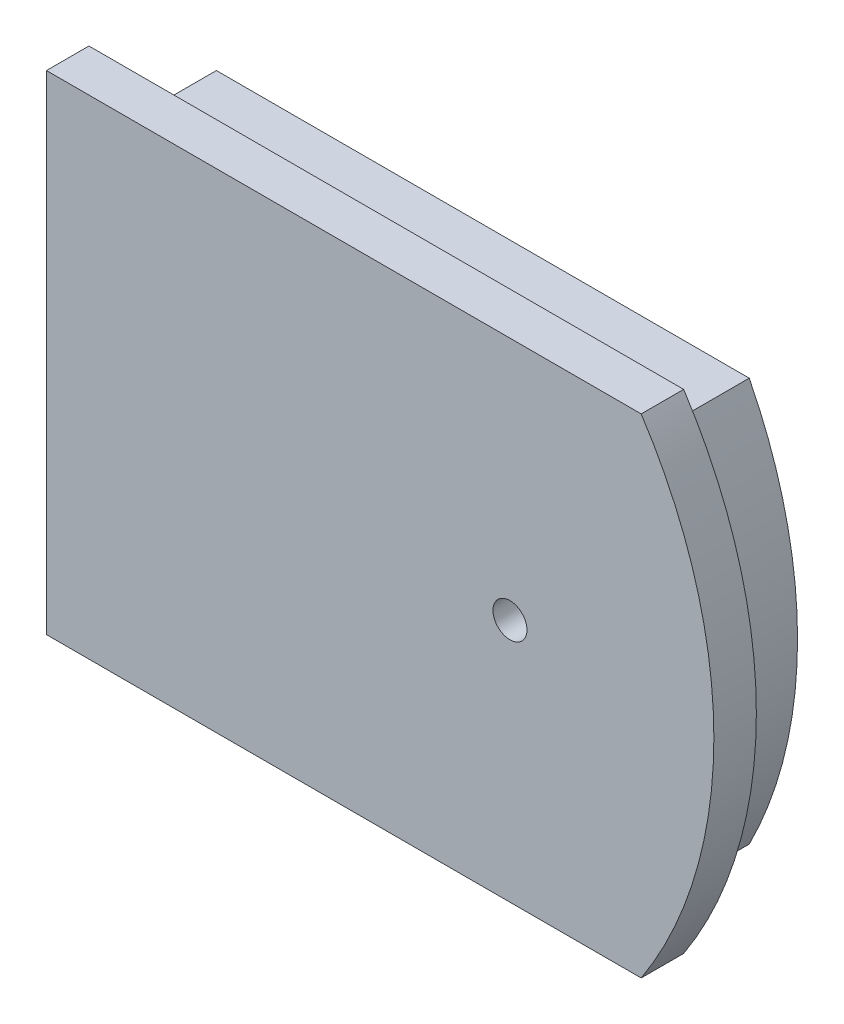
ISO-10303-21;
HEADER;
FILE_DESCRIPTION(('STEP AP214'),'2;1');
FILE_NAME('part.step','',(''),(''),'','','');
FILE_SCHEMA(('AUTOMOTIVE_DESIGN { 1 0 10303 214 1 1 1 1 }'));
ENDSEC;
DATA;
#1=APPLICATION_CONTEXT('core data for automotive mechanical design processes');
#2=APPLICATION_PROTOCOL_DEFINITION('international standard','automotive_design',2000,#1);
#3=PRODUCT_CONTEXT('',#1,'mechanical');
#4=PRODUCT('Part','Part','',(#3));
#5=PRODUCT_RELATED_PRODUCT_CATEGORY('part','',(#4));
#6=PRODUCT_DEFINITION_FORMATION('','',#4);
#7=PRODUCT_DEFINITION_CONTEXT('part definition',#1,'design');
#8=PRODUCT_DEFINITION('design','',#6,#7);
#9=PRODUCT_DEFINITION_SHAPE('','',#8);
#10=(LENGTH_UNIT() NAMED_UNIT(*) SI_UNIT(.MILLI.,.METRE.));
#11=(NAMED_UNIT(*) PLANE_ANGLE_UNIT() SI_UNIT($,.RADIAN.));
#12=(NAMED_UNIT(*) SI_UNIT($,.STERADIAN.) SOLID_ANGLE_UNIT());
#13=UNCERTAINTY_MEASURE_WITH_UNIT(LENGTH_MEASURE(1.E-05),#10,'distance_accuracy_value','');
#14=(GEOMETRIC_REPRESENTATION_CONTEXT(3) GLOBAL_UNCERTAINTY_ASSIGNED_CONTEXT((#13)) GLOBAL_UNIT_ASSIGNED_CONTEXT((#10,
#11,#12)) REPRESENTATION_CONTEXT('',''));
#15=CARTESIAN_POINT('',(0.,0.,0.));
#16=DIRECTION('',(0.,0.,1.));
#17=DIRECTION('',(1.,0.,0.));
#18=AXIS2_PLACEMENT_3D('',#15,#16,#17);
#19=CARTESIAN_POINT('',(0.,0.,0.));
#20=DIRECTION('',(0.,0.,-1.));
#21=DIRECTION('',(-1.,0.,0.));
#22=AXIS2_PLACEMENT_3D('',#19,#20,#21);
#23=PLANE('',#22);
#24=CARTESIAN_POINT('',(-28.0676149977944,0.,0.));
#25=DIRECTION('',(0.,0.,-1.));
#26=DIRECTION('',(-1.,0.,0.));
#27=AXIS2_PLACEMENT_3D('',#24,#25,#26);
#28=CIRCLE('',#27,104.87320161785);
#29=CARTESIAN_POINT('',(65.4317883028584,47.5,0.));
#30=VERTEX_POINT('',#29);
#31=CARTESIAN_POINT('',(65.4317883028584,-47.5,0.));
#32=VERTEX_POINT('',#31);
#33=EDGE_CURVE('E147',#30,#32,#28,.T.);
#34=ORIENTED_EDGE('',*,*,#33,.F.);
#35=DIRECTION('',(1.,0.,0.));
#36=VECTOR('',#35,1.);
#37=CARTESIAN_POINT('',(-60.,47.5,0.));
#38=LINE('',#37,#36);
#39=CARTESIAN_POINT('',(-60.,47.5,0.));
#40=VERTEX_POINT('',#39);
#41=EDGE_CURVE('E143',#40,#30,#38,.T.);
#42=ORIENTED_EDGE('',*,*,#41,.F.);
#43=DIRECTION('',(0.,-1.,0.));
#44=VECTOR('',#43,1.);
#45=CARTESIAN_POINT('',(-60.,47.5,0.));
#46=LINE('',#45,#44);
#47=CARTESIAN_POINT('',(-60.,-47.5,0.));
#48=VERTEX_POINT('',#47);
#49=EDGE_CURVE('E139',#40,#48,#46,.T.);
#50=ORIENTED_EDGE('',*,*,#49,.T.);
#51=DIRECTION('',(1.,0.,0.));
#52=VECTOR('',#51,1.);
#53=CARTESIAN_POINT('',(-60.,-47.5,0.));
#54=LINE('',#53,#52);
#55=EDGE_CURVE('E56',#48,#32,#54,.T.);
#56=ORIENTED_EDGE('',*,*,#55,.T.);
#57=EDGE_LOOP('',(#34,#42,#50,#56));
#58=FACE_BOUND('',#57,.T.);
#59=DIRECTION('',(1.,0.,0.));
#60=VECTOR('',#59,1.);
#61=CARTESIAN_POINT('',(-70.,-57.5,0.));
#62=LINE('',#61,#60);
#63=CARTESIAN_POINT('',(-70.,-57.5,0.));
#64=VERTEX_POINT('',#63);
#65=CARTESIAN_POINT('',(70.,-57.5,0.));
#66=VERTEX_POINT('',#65);
#67=EDGE_CURVE('E97',#64,#66,#62,.T.);
#68=ORIENTED_EDGE('',*,*,#67,.F.);
#69=DIRECTION('',(0.,-1.,0.));
#70=VECTOR('',#69,1.);
#71=CARTESIAN_POINT('',(-70.,57.5,0.));
#72=LINE('',#71,#70);
#73=CARTESIAN_POINT('',(-70.,57.5,0.));
#74=VERTEX_POINT('',#73);
#75=EDGE_CURVE('E81',#74,#64,#72,.T.);
#76=ORIENTED_EDGE('',*,*,#75,.F.);
#77=DIRECTION('',(1.,0.,0.));
#78=VECTOR('',#77,1.);
#79=CARTESIAN_POINT('',(-70.,57.5,0.));
#80=LINE('',#79,#78);
#81=CARTESIAN_POINT('',(70.,57.5,0.));
#82=VERTEX_POINT('',#81);
#83=EDGE_CURVE('E92',#74,#82,#80,.T.);
#84=ORIENTED_EDGE('',*,*,#83,.T.);
#85=CARTESIAN_POINT('',(-18.0676149977944,0.,0.));
#86=DIRECTION('',(0.,0.,1.));
#87=DIRECTION('',(1.,0.,0.));
#88=AXIS2_PLACEMENT_3D('',#85,#86,#87);
#89=CIRCLE('',#88,105.176778860164);
#90=EDGE_CURVE('E100',#66,#82,#89,.T.);
#91=ORIENTED_EDGE('',*,*,#90,.F.);
#92=EDGE_LOOP('',(#68,#76,#84,#91));
#93=FACE_BOUND('',#92,.T.);
#94=ADVANCED_FACE('F41',(#58,#93),#23,.T.);
#95=CARTESIAN_POINT('',(-70.,-57.5,10.));
#96=DIRECTION('',(0.,1.,0.));
#97=DIRECTION('',(0.,0.,1.));
#98=AXIS2_PLACEMENT_3D('',#95,#96,#97);
#99=PLANE('',#98);
#100=ORIENTED_EDGE('',*,*,#67,.T.);
#101=DIRECTION('',(0.,0.,-1.));
#102=VECTOR('',#101,1.);
#103=CARTESIAN_POINT('',(70.,-57.5,10.));
#104=LINE('',#103,#102);
#105=CARTESIAN_POINT('',(70.,-57.5,10.));
#106=VERTEX_POINT('',#105);
#107=EDGE_CURVE('E11',#106,#66,#104,.T.);
#108=ORIENTED_EDGE('',*,*,#107,.F.);
#109=DIRECTION('',(1.,0.,0.));
#110=VECTOR('',#109,1.);
#111=CARTESIAN_POINT('',(-70.,-57.5,10.));
#112=LINE('',#111,#110);
#113=CARTESIAN_POINT('',(-70.,-57.5,10.));
#114=VERTEX_POINT('',#113);
#115=EDGE_CURVE('E91',#114,#106,#112,.T.);
#116=ORIENTED_EDGE('',*,*,#115,.F.);
#117=DIRECTION('',(0.,0.,-1.));
#118=VECTOR('',#117,1.);
#119=CARTESIAN_POINT('',(-70.,-57.5,10.));
#120=LINE('',#119,#118);
#121=EDGE_CURVE('E84',#114,#64,#120,.T.);
#122=ORIENTED_EDGE('',*,*,#121,.T.);
#123=EDGE_LOOP('',(#100,#108,#116,#122));
#124=FACE_BOUND('',#123,.T.);
#125=ADVANCED_FACE('F43',(#124),#99,.F.);
#126=CARTESIAN_POINT('',(-70.,57.5,10.));
#127=DIRECTION('',(0.,1.,0.));
#128=DIRECTION('',(0.,0.,1.));
#129=AXIS2_PLACEMENT_3D('',#126,#127,#128);
#130=PLANE('',#129);
#131=ORIENTED_EDGE('',*,*,#83,.F.);
#132=DIRECTION('',(0.,0.,-1.));
#133=VECTOR('',#132,1.);
#134=CARTESIAN_POINT('',(-70.,57.5,10.));
#135=LINE('',#134,#133);
#136=CARTESIAN_POINT('',(-70.,57.5,10.));
#137=VERTEX_POINT('',#136);
#138=EDGE_CURVE('E86',#137,#74,#135,.T.);
#139=ORIENTED_EDGE('',*,*,#138,.F.);
#140=DIRECTION('',(1.,0.,0.));
#141=VECTOR('',#140,1.);
#142=CARTESIAN_POINT('',(-70.,57.5,10.));
#143=LINE('',#142,#141);
#144=CARTESIAN_POINT('',(70.,57.5,10.));
#145=VERTEX_POINT('',#144);
#146=EDGE_CURVE('E114',#137,#145,#143,.T.);
#147=ORIENTED_EDGE('',*,*,#146,.T.);
#148=DIRECTION('',(0.,0.,-1.));
#149=VECTOR('',#148,1.);
#150=CARTESIAN_POINT('',(70.,57.5,10.));
#151=LINE('',#150,#149);
#152=EDGE_CURVE('E49',#145,#82,#151,.T.);
#153=ORIENTED_EDGE('',*,*,#152,.T.);
#154=EDGE_LOOP('',(#131,#139,#147,#153));
#155=FACE_BOUND('',#154,.T.);
#156=ADVANCED_FACE('F112',(#155),#130,.T.);
#157=CARTESIAN_POINT('',(-70.,57.5,10.));
#158=DIRECTION('',(1.,0.,0.));
#159=DIRECTION('',(0.,0.,-1.));
#160=AXIS2_PLACEMENT_3D('',#157,#158,#159);
#161=PLANE('',#160);
#162=ORIENTED_EDGE('',*,*,#75,.T.);
#163=ORIENTED_EDGE('',*,*,#121,.F.);
#164=DIRECTION('',(0.,-1.,0.));
#165=VECTOR('',#164,1.);
#166=CARTESIAN_POINT('',(-70.,57.5,10.));
#167=LINE('',#166,#165);
#168=EDGE_CURVE('E65',#137,#114,#167,.T.);
#169=ORIENTED_EDGE('',*,*,#168,.F.);
#170=ORIENTED_EDGE('',*,*,#138,.T.);
#171=EDGE_LOOP('',(#162,#163,#169,#170));
#172=FACE_BOUND('',#171,.T.);
#173=ADVANCED_FACE('F83',(#172),#161,.F.);
#174=CARTESIAN_POINT('',(0.,0.,10.));
#175=DIRECTION('',(0.,0.,-1.));
#176=DIRECTION('',(-1.,0.,0.));
#177=AXIS2_PLACEMENT_3D('',#174,#175,#176);
#178=PLANE('',#177);
#179=CARTESIAN_POINT('',(39.1091638623691,0.,10.));
#180=DIRECTION('',(0.,0.,1.));
#181=DIRECTION('',(1.,0.,0.));
#182=AXIS2_PLACEMENT_3D('',#179,#180,#181);
#183=CIRCLE('',#182,4.00000000000001);
#184=CARTESIAN_POINT('',(43.1091638623691,0.,10.));
#185=VERTEX_POINT('',#184);
#186=EDGE_CURVE('E122',#185,#185,#183,.T.);
#187=ORIENTED_EDGE('',*,*,#186,.F.);
#188=EDGE_LOOP('',(#187));
#189=FACE_BOUND('',#188,.T.);
#190=ORIENTED_EDGE('',*,*,#115,.T.);
#191=CARTESIAN_POINT('',(-18.0676149977944,0.,10.));
#192=DIRECTION('',(0.,0.,1.));
#193=DIRECTION('',(1.,0.,0.));
#194=AXIS2_PLACEMENT_3D('',#191,#192,#193);
#195=CIRCLE('',#194,105.176778860164);
#196=EDGE_CURVE('E103',#106,#145,#195,.T.);
#197=ORIENTED_EDGE('',*,*,#196,.T.);
#198=ORIENTED_EDGE('',*,*,#146,.F.);
#199=ORIENTED_EDGE('',*,*,#168,.T.);
#200=EDGE_LOOP('',(#190,#197,#198,#199));
#201=FACE_BOUND('',#200,.T.);
#202=ADVANCED_FACE('F121',(#189,#201),#178,.F.);
#203=CARTESIAN_POINT('',(-18.0676149977944,0.,0.));
#204=DIRECTION('',(0.,0.,1.));
#205=DIRECTION('',(1.,0.,0.));
#206=AXIS2_PLACEMENT_3D('',#203,#204,#205);
#207=CYLINDRICAL_SURFACE('',#206,105.176778860164);
#208=ORIENTED_EDGE('',*,*,#196,.F.);
#209=ORIENTED_EDGE('',*,*,#107,.T.);
#210=ORIENTED_EDGE('',*,*,#90,.T.);
#211=ORIENTED_EDGE('',*,*,#152,.F.);
#212=EDGE_LOOP('',(#208,#209,#210,#211));
#213=FACE_BOUND('',#212,.T.);
#214=ADVANCED_FACE('F119',(#213),#207,.T.);
#215=CARTESIAN_POINT('',(39.1091638623691,0.,0.));
#216=DIRECTION('',(0.,0.,1.));
#217=DIRECTION('',(1.,0.,0.));
#218=AXIS2_PLACEMENT_3D('',#215,#216,#217);
#219=CYLINDRICAL_SURFACE('',#218,4.00000000000001);
#220=ORIENTED_EDGE('',*,*,#186,.T.);
#221=EDGE_LOOP('',(#220));
#222=FACE_BOUND('',#221,.T.);
#223=CARTESIAN_POINT('',(39.1091638623691,0.,-20.));
#224=DIRECTION('',(0.,0.,1.));
#225=DIRECTION('',(1.,0.,0.));
#226=AXIS2_PLACEMENT_3D('',#223,#224,#225);
#227=CIRCLE('',#226,4.00000000000001);
#228=CARTESIAN_POINT('',(43.1091638623691,0.,-20.));
#229=VERTEX_POINT('',#228);
#230=EDGE_CURVE('E158',#229,#229,#227,.T.);
#231=ORIENTED_EDGE('',*,*,#230,.F.);
#232=EDGE_LOOP('',(#231));
#233=FACE_BOUND('',#232,.T.);
#234=ADVANCED_FACE('F167',(#222,#233),#219,.F.);
#235=CARTESIAN_POINT('',(0.,0.,-20.));
#236=DIRECTION('',(0.,0.,-1.));
#237=DIRECTION('',(-1.,0.,0.));
#238=AXIS2_PLACEMENT_3D('',#235,#236,#237);
#239=PLANE('',#238);
#240=ORIENTED_EDGE('',*,*,#230,.T.);
#241=EDGE_LOOP('',(#240));
#242=FACE_BOUND('',#241,.T.);
#243=DIRECTION('',(1.,0.,0.));
#244=VECTOR('',#243,1.);
#245=CARTESIAN_POINT('',(-60.,-47.5,-20.));
#246=LINE('',#245,#244);
#247=CARTESIAN_POINT('',(-60.,-47.5,-20.));
#248=VERTEX_POINT('',#247);
#249=CARTESIAN_POINT('',(65.4317883028584,-47.5,-20.));
#250=VERTEX_POINT('',#249);
#251=EDGE_CURVE('E142',#248,#250,#246,.T.);
#252=ORIENTED_EDGE('',*,*,#251,.F.);
#253=DIRECTION('',(0.,-1.,0.));
#254=VECTOR('',#253,1.);
#255=CARTESIAN_POINT('',(-60.,47.5,-20.));
#256=LINE('',#255,#254);
#257=CARTESIAN_POINT('',(-60.,47.5,-20.));
#258=VERTEX_POINT('',#257);
#259=EDGE_CURVE('E132',#258,#248,#256,.T.);
#260=ORIENTED_EDGE('',*,*,#259,.F.);
#261=DIRECTION('',(1.,0.,0.));
#262=VECTOR('',#261,1.);
#263=CARTESIAN_POINT('',(-60.,47.5,-20.));
#264=LINE('',#263,#262);
#265=CARTESIAN_POINT('',(65.4317883028584,47.5,-20.));
#266=VERTEX_POINT('',#265);
#267=EDGE_CURVE('E150',#258,#266,#264,.T.);
#268=ORIENTED_EDGE('',*,*,#267,.T.);
#269=CARTESIAN_POINT('',(-28.0676149977944,0.,-20.));
#270=DIRECTION('',(0.,0.,-1.));
#271=DIRECTION('',(-1.,0.,0.));
#272=AXIS2_PLACEMENT_3D('',#269,#270,#271);
#273=CIRCLE('',#272,104.87320161785);
#274=EDGE_CURVE('E155',#266,#250,#273,.T.);
#275=ORIENTED_EDGE('',*,*,#274,.T.);
#276=EDGE_LOOP('',(#252,#260,#268,#275));
#277=FACE_BOUND('',#276,.T.);
#278=ADVANCED_FACE('F164',(#242,#277),#239,.T.);
#279=CARTESIAN_POINT('',(-60.,47.5,-20.));
#280=DIRECTION('',(0.,-1.,0.));
#281=DIRECTION('',(0.,0.,-1.));
#282=AXIS2_PLACEMENT_3D('',#279,#280,#281);
#283=PLANE('',#282);
#284=ORIENTED_EDGE('',*,*,#41,.T.);
#285=DIRECTION('',(0.,0.,1.));
#286=VECTOR('',#285,1.);
#287=CARTESIAN_POINT('',(65.4317883028584,47.5,-20.));
#288=LINE('',#287,#286);
#289=EDGE_CURVE('E131',#266,#30,#288,.T.);
#290=ORIENTED_EDGE('',*,*,#289,.F.);
#291=ORIENTED_EDGE('',*,*,#267,.F.);
#292=DIRECTION('',(0.,0.,1.));
#293=VECTOR('',#292,1.);
#294=CARTESIAN_POINT('',(-60.,47.5,-20.));
#295=LINE('',#294,#293);
#296=EDGE_CURVE('E135',#258,#40,#295,.T.);
#297=ORIENTED_EDGE('',*,*,#296,.T.);
#298=EDGE_LOOP('',(#284,#290,#291,#297));
#299=FACE_BOUND('',#298,.T.);
#300=ADVANCED_FACE('F175',(#299),#283,.F.);
#301=CARTESIAN_POINT('',(-60.,47.5,-20.));
#302=DIRECTION('',(-1.,0.,0.));
#303=DIRECTION('',(0.,0.,1.));
#304=AXIS2_PLACEMENT_3D('',#301,#302,#303);
#305=PLANE('',#304);
#306=ORIENTED_EDGE('',*,*,#49,.F.);
#307=ORIENTED_EDGE('',*,*,#296,.F.);
#308=ORIENTED_EDGE('',*,*,#259,.T.);
#309=DIRECTION('',(0.,0.,1.));
#310=VECTOR('',#309,1.);
#311=CARTESIAN_POINT('',(-60.,-47.5,-20.));
#312=LINE('',#311,#310);
#313=EDGE_CURVE('E125',#248,#48,#312,.T.);
#314=ORIENTED_EDGE('',*,*,#313,.T.);
#315=EDGE_LOOP('',(#306,#307,#308,#314));
#316=FACE_BOUND('',#315,.T.);
#317=ADVANCED_FACE('F259',(#316),#305,.T.);
#318=CARTESIAN_POINT('',(-60.,-47.5,-20.));
#319=DIRECTION('',(0.,-1.,0.));
#320=DIRECTION('',(0.,0.,-1.));
#321=AXIS2_PLACEMENT_3D('',#318,#319,#320);
#322=PLANE('',#321);
#323=ORIENTED_EDGE('',*,*,#55,.F.);
#324=ORIENTED_EDGE('',*,*,#313,.F.);
#325=ORIENTED_EDGE('',*,*,#251,.T.);
#326=DIRECTION('',(0.,0.,1.));
#327=VECTOR('',#326,1.);
#328=CARTESIAN_POINT('',(65.4317883028584,-47.5,-20.));
#329=LINE('',#328,#327);
#330=EDGE_CURVE('E129',#250,#32,#329,.T.);
#331=ORIENTED_EDGE('',*,*,#330,.T.);
#332=EDGE_LOOP('',(#323,#324,#325,#331));
#333=FACE_BOUND('',#332,.T.);
#334=ADVANCED_FACE('F269',(#333),#322,.T.);
#335=CARTESIAN_POINT('',(-28.0676149977944,0.,0.));
#336=DIRECTION('',(0.,0.,-1.));
#337=DIRECTION('',(-1.,0.,0.));
#338=AXIS2_PLACEMENT_3D('',#335,#336,#337);
#339=CYLINDRICAL_SURFACE('',#338,104.87320161785);
#340=ORIENTED_EDGE('',*,*,#274,.F.);
#341=ORIENTED_EDGE('',*,*,#289,.T.);
#342=ORIENTED_EDGE('',*,*,#33,.T.);
#343=ORIENTED_EDGE('',*,*,#330,.F.);
#344=EDGE_LOOP('',(#340,#341,#342,#343));
#345=FACE_BOUND('',#344,.T.);
#346=ADVANCED_FACE('F278',(#345),#339,.T.);
#347=CLOSED_SHELL('',(#94,#125,#156,#173,#202,#214,#234,#278,#300,#317,#334,#346));
#348=MANIFOLD_SOLID_BREP('B2',#347);
#349=ADVANCED_BREP_SHAPE_REPRESENTATION('',(#18,#348),#14);
#350=SHAPE_DEFINITION_REPRESENTATION(#9,#349);
ENDSEC;
END-ISO-10303-21;
